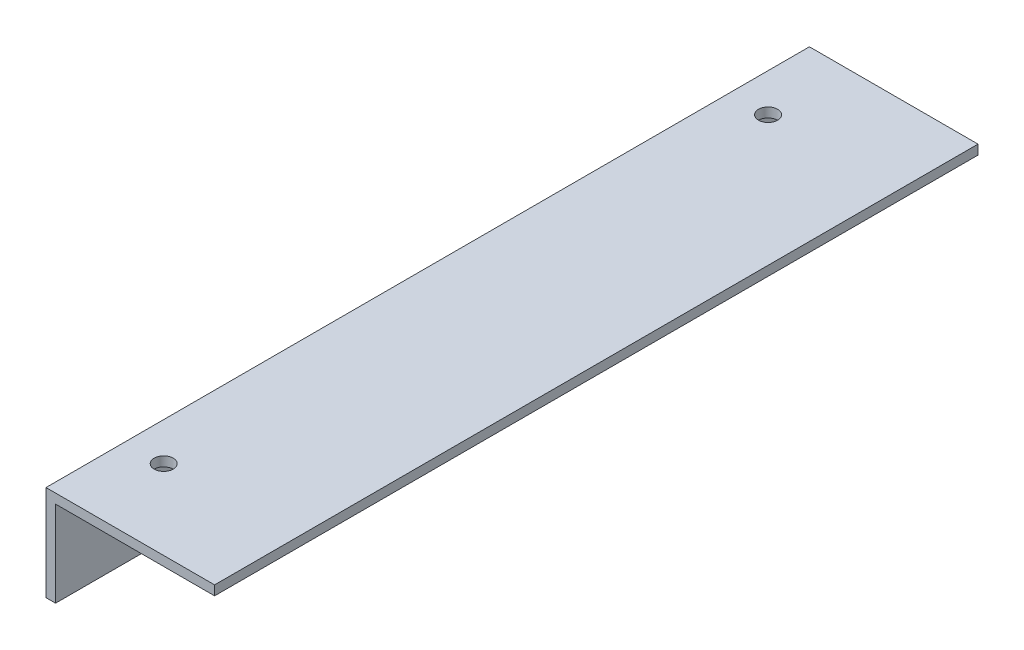
ISO-10303-21;
HEADER;
FILE_DESCRIPTION(('STEP AP214'),'2;1');
FILE_NAME('part.step','',(''),(''),'','','');
FILE_SCHEMA(('AUTOMOTIVE_DESIGN { 1 0 10303 214 1 1 1 1 }'));
ENDSEC;
DATA;
#1=APPLICATION_CONTEXT('core data for automotive mechanical design processes');
#2=APPLICATION_PROTOCOL_DEFINITION('international standard','automotive_design',2000,#1);
#3=PRODUCT_CONTEXT('',#1,'mechanical');
#4=PRODUCT('Part','Part','',(#3));
#5=PRODUCT_RELATED_PRODUCT_CATEGORY('part','',(#4));
#6=PRODUCT_DEFINITION_FORMATION('','',#4);
#7=PRODUCT_DEFINITION_CONTEXT('part definition',#1,'design');
#8=PRODUCT_DEFINITION('design','',#6,#7);
#9=PRODUCT_DEFINITION_SHAPE('','',#8);
#10=(LENGTH_UNIT() NAMED_UNIT(*) SI_UNIT(.MILLI.,.METRE.));
#11=(NAMED_UNIT(*) PLANE_ANGLE_UNIT() SI_UNIT($,.RADIAN.));
#12=(NAMED_UNIT(*) SI_UNIT($,.STERADIAN.) SOLID_ANGLE_UNIT());
#13=UNCERTAINTY_MEASURE_WITH_UNIT(LENGTH_MEASURE(1.E-05),#10,'distance_accuracy_value','');
#14=(GEOMETRIC_REPRESENTATION_CONTEXT(3) GLOBAL_UNCERTAINTY_ASSIGNED_CONTEXT((#13)) GLOBAL_UNIT_ASSIGNED_CONTEXT((#10,
#11,#12)) REPRESENTATION_CONTEXT('',''));
#15=CARTESIAN_POINT('',(0.,0.,0.));
#16=DIRECTION('',(0.,0.,1.));
#17=DIRECTION('',(1.,0.,0.));
#18=AXIS2_PLACEMENT_3D('',#15,#16,#17);
#19=CARTESIAN_POINT('',(0.,-15.,120.));
#20=DIRECTION('',(1.,0.,0.));
#21=DIRECTION('',(0.,0.,-1.));
#22=AXIS2_PLACEMENT_3D('',#19,#20,#21);
#23=PLANE('',#22);
#24=CARTESIAN_POINT('',(0.,-7.5,13.));
#25=DIRECTION('',(1.,0.,0.));
#26=DIRECTION('',(0.,1.,0.));
#27=AXIS2_PLACEMENT_3D('',#24,#25,#26);
#28=CIRCLE('',#27,1.5);
#29=CARTESIAN_POINT('',(0.,-6.,13.));
#30=VERTEX_POINT('',#29);
#31=EDGE_CURVE('E184',#30,#30,#28,.T.);
#32=ORIENTED_EDGE('',*,*,#31,.T.);
#33=EDGE_LOOP('',(#32));
#34=FACE_BOUND('',#33,.T.);
#35=CARTESIAN_POINT('',(0.,-7.5,107.));
#36=DIRECTION('',(1.,0.,0.));
#37=DIRECTION('',(0.,1.,0.));
#38=AXIS2_PLACEMENT_3D('',#35,#36,#37);
#39=CIRCLE('',#38,1.5);
#40=CARTESIAN_POINT('',(0.,-6.,107.));
#41=VERTEX_POINT('',#40);
#42=EDGE_CURVE('E188',#41,#41,#39,.T.);
#43=ORIENTED_EDGE('',*,*,#42,.T.);
#44=EDGE_LOOP('',(#43));
#45=FACE_BOUND('',#44,.T.);
#46=CARTESIAN_POINT('',(0.,-7.5,60.));
#47=DIRECTION('',(1.,0.,0.));
#48=DIRECTION('',(0.,1.,0.));
#49=AXIS2_PLACEMENT_3D('',#46,#47,#48);
#50=CIRCLE('',#49,1.5);
#51=CARTESIAN_POINT('',(0.,-6.,60.));
#52=VERTEX_POINT('',#51);
#53=EDGE_CURVE('E133',#52,#52,#50,.T.);
#54=ORIENTED_EDGE('',*,*,#53,.T.);
#55=EDGE_LOOP('',(#54));
#56=FACE_BOUND('',#55,.T.);
#57=DIRECTION('',(0.,-1.,0.));
#58=VECTOR('',#57,1.);
#59=CARTESIAN_POINT('',(0.,-15.,0.));
#60=LINE('',#59,#58);
#61=CARTESIAN_POINT('',(0.,0.,0.));
#62=VERTEX_POINT('',#61);
#63=CARTESIAN_POINT('',(0.,-15.,0.));
#64=VERTEX_POINT('',#63);
#65=EDGE_CURVE('E128',#62,#64,#60,.T.);
#66=ORIENTED_EDGE('',*,*,#65,.T.);
#67=DIRECTION('',(0.,0.,-1.));
#68=VECTOR('',#67,1.);
#69=CARTESIAN_POINT('',(0.,-15.,120.));
#70=LINE('',#69,#68);
#71=CARTESIAN_POINT('',(0.,-15.,120.));
#72=VERTEX_POINT('',#71);
#73=EDGE_CURVE('E11',#72,#64,#70,.T.);
#74=ORIENTED_EDGE('',*,*,#73,.F.);
#75=DIRECTION('',(0.,-1.,0.));
#76=VECTOR('',#75,1.);
#77=CARTESIAN_POINT('',(0.,-15.,120.));
#78=LINE('',#77,#76);
#79=CARTESIAN_POINT('',(0.,0.,120.));
#80=VERTEX_POINT('',#79);
#81=EDGE_CURVE('E145',#80,#72,#78,.T.);
#82=ORIENTED_EDGE('',*,*,#81,.F.);
#83=DIRECTION('',(0.,0.,-1.));
#84=VECTOR('',#83,1.);
#85=CARTESIAN_POINT('',(0.,0.,120.));
#86=LINE('',#85,#84);
#87=EDGE_CURVE('E124',#80,#62,#86,.T.);
#88=ORIENTED_EDGE('',*,*,#87,.T.);
#89=EDGE_LOOP('',(#66,#74,#82,#88));
#90=FACE_BOUND('',#89,.T.);
#91=ADVANCED_FACE('F39',(#34,#45,#56,#90),#23,.F.);
#92=CARTESIAN_POINT('',(1.5,-15.,120.));
#93=DIRECTION('',(0.,1.,0.));
#94=DIRECTION('',(0.,0.,1.));
#95=AXIS2_PLACEMENT_3D('',#92,#93,#94);
#96=PLANE('',#95);
#97=DIRECTION('',(1.,0.,0.));
#98=VECTOR('',#97,1.);
#99=CARTESIAN_POINT('',(1.5,-15.,0.));
#100=LINE('',#99,#98);
#101=CARTESIAN_POINT('',(1.5,-15.,0.));
#102=VERTEX_POINT('',#101);
#103=EDGE_CURVE('E132',#64,#102,#100,.T.);
#104=ORIENTED_EDGE('',*,*,#103,.T.);
#105=DIRECTION('',(0.,0.,-1.));
#106=VECTOR('',#105,1.);
#107=CARTESIAN_POINT('',(1.5,-15.,120.));
#108=LINE('',#107,#106);
#109=CARTESIAN_POINT('',(1.5,-15.,120.));
#110=VERTEX_POINT('',#109);
#111=EDGE_CURVE('E48',#110,#102,#108,.T.);
#112=ORIENTED_EDGE('',*,*,#111,.F.);
#113=DIRECTION('',(1.,0.,0.));
#114=VECTOR('',#113,1.);
#115=CARTESIAN_POINT('',(1.5,-15.,120.));
#116=LINE('',#115,#114);
#117=EDGE_CURVE('E93',#72,#110,#116,.T.);
#118=ORIENTED_EDGE('',*,*,#117,.F.);
#119=ORIENTED_EDGE('',*,*,#73,.T.);
#120=EDGE_LOOP('',(#104,#112,#118,#119));
#121=FACE_BOUND('',#120,.T.);
#122=ADVANCED_FACE('F176',(#121),#96,.F.);
#123=CARTESIAN_POINT('',(1.5,-1.5,120.));
#124=DIRECTION('',(-1.,0.,0.));
#125=DIRECTION('',(0.,-1.,0.));
#126=AXIS2_PLACEMENT_3D('',#123,#124,#125);
#127=PLANE('',#126);
#128=CARTESIAN_POINT('',(1.5,-7.5,13.));
#129=DIRECTION('',(1.,0.,0.));
#130=DIRECTION('',(0.,1.,0.));
#131=AXIS2_PLACEMENT_3D('',#128,#129,#130);
#132=CIRCLE('',#131,1.5);
#133=CARTESIAN_POINT('',(1.5,-6.,13.));
#134=VERTEX_POINT('',#133);
#135=EDGE_CURVE('E199',#134,#134,#132,.T.);
#136=ORIENTED_EDGE('',*,*,#135,.F.);
#137=EDGE_LOOP('',(#136));
#138=FACE_BOUND('',#137,.T.);
#139=CARTESIAN_POINT('',(1.5,-7.5,107.));
#140=DIRECTION('',(1.,0.,0.));
#141=DIRECTION('',(0.,1.,0.));
#142=AXIS2_PLACEMENT_3D('',#139,#140,#141);
#143=CIRCLE('',#142,1.5);
#144=CARTESIAN_POINT('',(1.5,-6.,107.));
#145=VERTEX_POINT('',#144);
#146=EDGE_CURVE('E211',#145,#145,#143,.T.);
#147=ORIENTED_EDGE('',*,*,#146,.F.);
#148=EDGE_LOOP('',(#147));
#149=FACE_BOUND('',#148,.T.);
#150=CARTESIAN_POINT('',(1.5,-7.5,60.));
#151=DIRECTION('',(1.,0.,0.));
#152=DIRECTION('',(0.,1.,0.));
#153=AXIS2_PLACEMENT_3D('',#150,#151,#152);
#154=CIRCLE('',#153,1.5);
#155=CARTESIAN_POINT('',(1.5,-6.,60.));
#156=VERTEX_POINT('',#155);
#157=EDGE_CURVE('E193',#156,#156,#154,.T.);
#158=ORIENTED_EDGE('',*,*,#157,.F.);
#159=EDGE_LOOP('',(#158));
#160=FACE_BOUND('',#159,.T.);
#161=DIRECTION('',(0.,1.,0.));
#162=VECTOR('',#161,1.);
#163=CARTESIAN_POINT('',(1.5,-1.5,0.));
#164=LINE('',#163,#162);
#165=CARTESIAN_POINT('',(1.5,-1.5,0.));
#166=VERTEX_POINT('',#165);
#167=EDGE_CURVE('E136',#102,#166,#164,.T.);
#168=ORIENTED_EDGE('',*,*,#167,.T.);
#169=DIRECTION('',(0.,0.,-1.));
#170=VECTOR('',#169,1.);
#171=CARTESIAN_POINT('',(1.5,-1.5,120.));
#172=LINE('',#171,#170);
#173=CARTESIAN_POINT('',(1.5,-1.5,120.));
#174=VERTEX_POINT('',#173);
#175=EDGE_CURVE('E117',#174,#166,#172,.T.);
#176=ORIENTED_EDGE('',*,*,#175,.F.);
#177=DIRECTION('',(0.,1.,0.));
#178=VECTOR('',#177,1.);
#179=CARTESIAN_POINT('',(1.5,-1.5,120.));
#180=LINE('',#179,#178);
#181=EDGE_CURVE('E106',#110,#174,#180,.T.);
#182=ORIENTED_EDGE('',*,*,#181,.F.);
#183=ORIENTED_EDGE('',*,*,#111,.T.);
#184=EDGE_LOOP('',(#168,#176,#182,#183));
#185=FACE_BOUND('',#184,.T.);
#186=ADVANCED_FACE('F155',(#138,#149,#160,#185),#127,.F.);
#187=CARTESIAN_POINT('',(26.5,-1.5,120.));
#188=DIRECTION('',(0.,1.,0.));
#189=DIRECTION('',(0.,0.,1.));
#190=AXIS2_PLACEMENT_3D('',#187,#188,#189);
#191=PLANE('',#190);
#192=CARTESIAN_POINT('',(5.99999999999998,-1.5,107.5));
#193=DIRECTION('',(0.,1.,0.));
#194=DIRECTION('',(0.,0.,1.));
#195=AXIS2_PLACEMENT_3D('',#192,#193,#194);
#196=CIRCLE('',#195,1.5);
#197=CARTESIAN_POINT('',(5.99999999999998,-1.5,109.));
#198=VERTEX_POINT('',#197);
#199=EDGE_CURVE('E208',#198,#198,#196,.T.);
#200=ORIENTED_EDGE('',*,*,#199,.T.);
#201=EDGE_LOOP('',(#200));
#202=FACE_BOUND('',#201,.T.);
#203=CARTESIAN_POINT('',(5.99999999999998,-1.5,12.5));
#204=DIRECTION('',(0.,1.,0.));
#205=DIRECTION('',(0.,0.,1.));
#206=AXIS2_PLACEMENT_3D('',#203,#204,#205);
#207=CIRCLE('',#206,1.5);
#208=CARTESIAN_POINT('',(5.99999999999998,-1.5,14.));
#209=VERTEX_POINT('',#208);
#210=EDGE_CURVE('E220',#209,#209,#207,.T.);
#211=ORIENTED_EDGE('',*,*,#210,.T.);
#212=EDGE_LOOP('',(#211));
#213=FACE_BOUND('',#212,.T.);
#214=DIRECTION('',(1.,0.,0.));
#215=VECTOR('',#214,1.);
#216=CARTESIAN_POINT('',(26.5,-1.5,0.));
#217=LINE('',#216,#215);
#218=CARTESIAN_POINT('',(26.5,-1.5,0.));
#219=VERTEX_POINT('',#218);
#220=EDGE_CURVE('E115',#166,#219,#217,.T.);
#221=ORIENTED_EDGE('',*,*,#220,.T.);
#222=DIRECTION('',(0.,0.,-1.));
#223=VECTOR('',#222,1.);
#224=CARTESIAN_POINT('',(26.5,-1.5,120.));
#225=LINE('',#224,#223);
#226=CARTESIAN_POINT('',(26.5,-1.5,120.));
#227=VERTEX_POINT('',#226);
#228=EDGE_CURVE('E112',#227,#219,#225,.T.);
#229=ORIENTED_EDGE('',*,*,#228,.F.);
#230=DIRECTION('',(1.,0.,0.));
#231=VECTOR('',#230,1.);
#232=CARTESIAN_POINT('',(26.5,-1.5,120.));
#233=LINE('',#232,#231);
#234=EDGE_CURVE('E100',#174,#227,#233,.T.);
#235=ORIENTED_EDGE('',*,*,#234,.F.);
#236=ORIENTED_EDGE('',*,*,#175,.T.);
#237=EDGE_LOOP('',(#221,#229,#235,#236));
#238=FACE_BOUND('',#237,.T.);
#239=ADVANCED_FACE('F113',(#202,#213,#238),#191,.F.);
#240=CARTESIAN_POINT('',(26.5,0.,120.));
#241=DIRECTION('',(-1.,0.,0.));
#242=DIRECTION('',(0.,0.,1.));
#243=AXIS2_PLACEMENT_3D('',#240,#241,#242);
#244=PLANE('',#243);
#245=DIRECTION('',(0.,1.,0.));
#246=VECTOR('',#245,1.);
#247=CARTESIAN_POINT('',(26.5,0.,0.));
#248=LINE('',#247,#246);
#249=CARTESIAN_POINT('',(26.5,0.,0.));
#250=VERTEX_POINT('',#249);
#251=EDGE_CURVE('E79',#219,#250,#248,.T.);
#252=ORIENTED_EDGE('',*,*,#251,.T.);
#253=DIRECTION('',(0.,0.,-1.));
#254=VECTOR('',#253,1.);
#255=CARTESIAN_POINT('',(26.5,0.,120.));
#256=LINE('',#255,#254);
#257=CARTESIAN_POINT('',(26.5,0.,120.));
#258=VERTEX_POINT('',#257);
#259=EDGE_CURVE('E118',#258,#250,#256,.T.);
#260=ORIENTED_EDGE('',*,*,#259,.F.);
#261=DIRECTION('',(0.,1.,0.));
#262=VECTOR('',#261,1.);
#263=CARTESIAN_POINT('',(26.5,0.,120.));
#264=LINE('',#263,#262);
#265=EDGE_CURVE('E104',#227,#258,#264,.T.);
#266=ORIENTED_EDGE('',*,*,#265,.F.);
#267=ORIENTED_EDGE('',*,*,#228,.T.);
#268=EDGE_LOOP('',(#252,#260,#266,#267));
#269=FACE_BOUND('',#268,.T.);
#270=ADVANCED_FACE('F120',(#269),#244,.F.);
#271=CARTESIAN_POINT('',(0.,0.,120.));
#272=DIRECTION('',(0.,-1.,0.));
#273=DIRECTION('',(0.,0.,-1.));
#274=AXIS2_PLACEMENT_3D('',#271,#272,#273);
#275=PLANE('',#274);
#276=CARTESIAN_POINT('',(5.99999999999998,0.,107.5));
#277=DIRECTION('',(0.,1.,0.));
#278=DIRECTION('',(0.,0.,1.));
#279=AXIS2_PLACEMENT_3D('',#276,#277,#278);
#280=CIRCLE('',#279,1.5);
#281=CARTESIAN_POINT('',(5.99999999999998,0.,109.));
#282=VERTEX_POINT('',#281);
#283=EDGE_CURVE('E224',#282,#282,#280,.T.);
#284=ORIENTED_EDGE('',*,*,#283,.F.);
#285=EDGE_LOOP('',(#284));
#286=FACE_BOUND('',#285,.T.);
#287=CARTESIAN_POINT('',(5.99999999999998,0.,12.5));
#288=DIRECTION('',(0.,1.,0.));
#289=DIRECTION('',(0.,0.,-1.));
#290=AXIS2_PLACEMENT_3D('',#287,#288,#289);
#291=CIRCLE('',#290,1.5);
#292=CARTESIAN_POINT('',(5.99999999999998,0.,11.));
#293=VERTEX_POINT('',#292);
#294=EDGE_CURVE('E225',#293,#293,#291,.T.);
#295=ORIENTED_EDGE('',*,*,#294,.F.);
#296=EDGE_LOOP('',(#295));
#297=FACE_BOUND('',#296,.T.);
#298=DIRECTION('',(-1.,0.,0.));
#299=VECTOR('',#298,1.);
#300=CARTESIAN_POINT('',(0.,0.,0.));
#301=LINE('',#300,#299);
#302=EDGE_CURVE('E85',#250,#62,#301,.T.);
#303=ORIENTED_EDGE('',*,*,#302,.T.);
#304=ORIENTED_EDGE('',*,*,#87,.F.);
#305=DIRECTION('',(-1.,0.,0.));
#306=VECTOR('',#305,1.);
#307=CARTESIAN_POINT('',(0.,0.,120.));
#308=LINE('',#307,#306);
#309=EDGE_CURVE('E56',#258,#80,#308,.T.);
#310=ORIENTED_EDGE('',*,*,#309,.F.);
#311=ORIENTED_EDGE('',*,*,#259,.T.);
#312=EDGE_LOOP('',(#303,#304,#310,#311));
#313=FACE_BOUND('',#312,.T.);
#314=ADVANCED_FACE('F162',(#286,#297,#313),#275,.F.);
#315=CARTESIAN_POINT('',(0.,0.,120.));
#316=DIRECTION('',(0.,0.,-1.));
#317=DIRECTION('',(-1.,0.,0.));
#318=AXIS2_PLACEMENT_3D('',#315,#316,#317);
#319=PLANE('',#318);
#320=ORIENTED_EDGE('',*,*,#81,.T.);
#321=ORIENTED_EDGE('',*,*,#117,.T.);
#322=ORIENTED_EDGE('',*,*,#181,.T.);
#323=ORIENTED_EDGE('',*,*,#234,.T.);
#324=ORIENTED_EDGE('',*,*,#265,.T.);
#325=ORIENTED_EDGE('',*,*,#309,.T.);
#326=EDGE_LOOP('',(#320,#321,#322,#323,#324,#325));
#327=FACE_BOUND('',#326,.T.);
#328=ADVANCED_FACE('F102',(#327),#319,.F.);
#329=CARTESIAN_POINT('',(0.,0.,0.));
#330=DIRECTION('',(0.,0.,-1.));
#331=DIRECTION('',(-1.,0.,0.));
#332=AXIS2_PLACEMENT_3D('',#329,#330,#331);
#333=PLANE('',#332);
#334=ORIENTED_EDGE('',*,*,#65,.F.);
#335=ORIENTED_EDGE('',*,*,#302,.F.);
#336=ORIENTED_EDGE('',*,*,#251,.F.);
#337=ORIENTED_EDGE('',*,*,#220,.F.);
#338=ORIENTED_EDGE('',*,*,#167,.F.);
#339=ORIENTED_EDGE('',*,*,#103,.F.);
#340=EDGE_LOOP('',(#334,#335,#336,#337,#338,#339));
#341=FACE_BOUND('',#340,.T.);
#342=ADVANCED_FACE('F158',(#341),#333,.T.);
#343=CARTESIAN_POINT('',(0.,-7.5,60.));
#344=DIRECTION('',(1.,0.,0.));
#345=DIRECTION('',(0.,1.,0.));
#346=AXIS2_PLACEMENT_3D('',#343,#344,#345);
#347=CYLINDRICAL_SURFACE('',#346,1.5);
#348=ORIENTED_EDGE('',*,*,#53,.F.);
#349=EDGE_LOOP('',(#348));
#350=FACE_BOUND('',#349,.T.);
#351=ORIENTED_EDGE('',*,*,#157,.T.);
#352=EDGE_LOOP('',(#351));
#353=FACE_BOUND('',#352,.T.);
#354=ADVANCED_FACE('F256',(#350,#353),#347,.F.);
#355=CARTESIAN_POINT('',(0.,-7.5,107.));
#356=DIRECTION('',(1.,0.,0.));
#357=DIRECTION('',(0.,1.,0.));
#358=AXIS2_PLACEMENT_3D('',#355,#356,#357);
#359=CYLINDRICAL_SURFACE('',#358,1.5);
#360=ORIENTED_EDGE('',*,*,#42,.F.);
#361=EDGE_LOOP('',(#360));
#362=FACE_BOUND('',#361,.T.);
#363=ORIENTED_EDGE('',*,*,#146,.T.);
#364=EDGE_LOOP('',(#363));
#365=FACE_BOUND('',#364,.T.);
#366=ADVANCED_FACE('F251',(#362,#365),#359,.F.);
#367=CARTESIAN_POINT('',(0.,-7.5,13.));
#368=DIRECTION('',(1.,0.,0.));
#369=DIRECTION('',(0.,1.,0.));
#370=AXIS2_PLACEMENT_3D('',#367,#368,#369);
#371=CYLINDRICAL_SURFACE('',#370,1.5);
#372=ORIENTED_EDGE('',*,*,#31,.F.);
#373=EDGE_LOOP('',(#372));
#374=FACE_BOUND('',#373,.T.);
#375=ORIENTED_EDGE('',*,*,#135,.T.);
#376=EDGE_LOOP('',(#375));
#377=FACE_BOUND('',#376,.T.);
#378=ADVANCED_FACE('F245',(#374,#377),#371,.F.);
#379=CARTESIAN_POINT('',(5.99999999999998,-15.,12.5));
#380=DIRECTION('',(0.,1.,0.));
#381=DIRECTION('',(0.,0.,1.));
#382=AXIS2_PLACEMENT_3D('',#379,#380,#381);
#383=CYLINDRICAL_SURFACE('',#382,1.5);
#384=ORIENTED_EDGE('',*,*,#294,.T.);
#385=EDGE_LOOP('',(#384));
#386=FACE_BOUND('',#385,.T.);
#387=ORIENTED_EDGE('',*,*,#210,.F.);
#388=EDGE_LOOP('',(#387));
#389=FACE_BOUND('',#388,.T.);
#390=ADVANCED_FACE('F235',(#386,#389),#383,.F.);
#391=CARTESIAN_POINT('',(5.99999999999998,-15.,107.5));
#392=DIRECTION('',(0.,1.,0.));
#393=DIRECTION('',(0.,0.,1.));
#394=AXIS2_PLACEMENT_3D('',#391,#392,#393);
#395=CYLINDRICAL_SURFACE('',#394,1.5);
#396=ORIENTED_EDGE('',*,*,#283,.T.);
#397=EDGE_LOOP('',(#396));
#398=FACE_BOUND('',#397,.T.);
#399=ORIENTED_EDGE('',*,*,#199,.F.);
#400=EDGE_LOOP('',(#399));
#401=FACE_BOUND('',#400,.T.);
#402=ADVANCED_FACE('F232',(#398,#401),#395,.F.);
#403=CLOSED_SHELL('',(#91,#122,#186,#239,#270,#314,#328,#342,#354,#366,#378,#390,#402));
#404=MANIFOLD_SOLID_BREP('B2',#403);
#405=ADVANCED_BREP_SHAPE_REPRESENTATION('',(#18,#404),#14);
#406=SHAPE_DEFINITION_REPRESENTATION(#9,#405);
ENDSEC;
END-ISO-10303-21;
